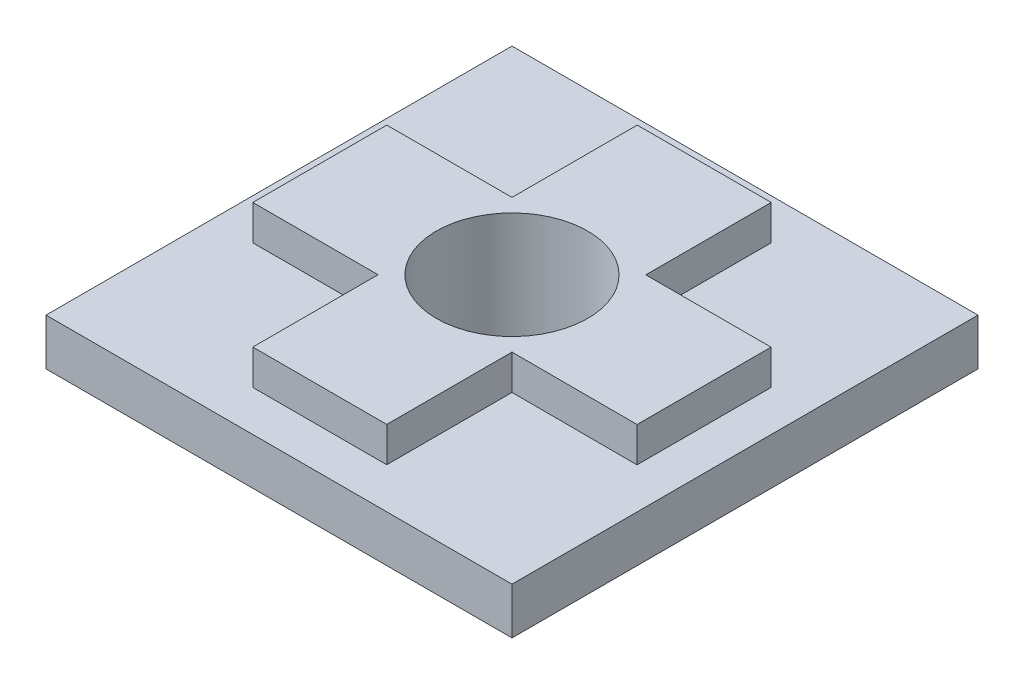
ISO-10303-21;
HEADER;
FILE_DESCRIPTION(('STEP AP214'),'2;1');
FILE_NAME('part.step','',(''),(''),'','','');
FILE_SCHEMA(('AUTOMOTIVE_DESIGN { 1 0 10303 214 1 1 1 1 }'));
ENDSEC;
DATA;
#1=APPLICATION_CONTEXT('core data for automotive mechanical design processes');
#2=APPLICATION_PROTOCOL_DEFINITION('international standard','automotive_design',2000,#1);
#3=PRODUCT_CONTEXT('',#1,'mechanical');
#4=PRODUCT('Part','Part','',(#3));
#5=PRODUCT_RELATED_PRODUCT_CATEGORY('part','',(#4));
#6=PRODUCT_DEFINITION_FORMATION('','',#4);
#7=PRODUCT_DEFINITION_CONTEXT('part definition',#1,'design');
#8=PRODUCT_DEFINITION('design','',#6,#7);
#9=PRODUCT_DEFINITION_SHAPE('','',#8);
#10=(LENGTH_UNIT() NAMED_UNIT(*) SI_UNIT(.MILLI.,.METRE.));
#11=(NAMED_UNIT(*) PLANE_ANGLE_UNIT() SI_UNIT($,.RADIAN.));
#12=(NAMED_UNIT(*) SI_UNIT($,.STERADIAN.) SOLID_ANGLE_UNIT());
#13=UNCERTAINTY_MEASURE_WITH_UNIT(LENGTH_MEASURE(1.E-05),#10,'distance_accuracy_value','');
#14=(GEOMETRIC_REPRESENTATION_CONTEXT(3) GLOBAL_UNCERTAINTY_ASSIGNED_CONTEXT((#13)) GLOBAL_UNIT_ASSIGNED_CONTEXT((#10,
#11,#12)) REPRESENTATION_CONTEXT('',''));
#15=CARTESIAN_POINT('',(0.,0.,0.));
#16=DIRECTION('',(0.,0.,1.));
#17=DIRECTION('',(1.,0.,0.));
#18=AXIS2_PLACEMENT_3D('',#15,#16,#17);
#19=CARTESIAN_POINT('',(0.,3.5,0.));
#20=DIRECTION('',(0.,-1.,0.));
#21=DIRECTION('',(0.,0.,-1.));
#22=AXIS2_PLACEMENT_3D('',#19,#20,#21);
#23=PLANE('',#22);
#24=DIRECTION('',(0.,0.,1.));
#25=VECTOR('',#24,1.);
#26=CARTESIAN_POINT('',(-2.875,3.5,-8.25));
#27=LINE('',#26,#25);
#28=CARTESIAN_POINT('',(-2.875,3.5,-8.25));
#29=VERTEX_POINT('',#28);
#30=CARTESIAN_POINT('',(-2.875,3.5,-2.875));
#31=VERTEX_POINT('',#30);
#32=EDGE_CURVE('E228',#29,#31,#27,.T.);
#33=ORIENTED_EDGE('',*,*,#32,.T.);
#34=DIRECTION('',(-1.,0.,0.));
#35=VECTOR('',#34,1.);
#36=CARTESIAN_POINT('',(-2.875,3.5,-2.875));
#37=LINE('',#36,#35);
#38=CARTESIAN_POINT('',(-8.25,3.5,-2.875));
#39=VERTEX_POINT('',#38);
#40=EDGE_CURVE('E236',#31,#39,#37,.T.);
#41=ORIENTED_EDGE('',*,*,#40,.T.);
#42=DIRECTION('',(0.,0.,1.));
#43=VECTOR('',#42,1.);
#44=CARTESIAN_POINT('',(-8.25,3.5,2.875));
#45=LINE('',#44,#43);
#46=CARTESIAN_POINT('',(-8.25,3.5,2.875));
#47=VERTEX_POINT('',#46);
#48=EDGE_CURVE('E244',#39,#47,#45,.T.);
#49=ORIENTED_EDGE('',*,*,#48,.T.);
#50=DIRECTION('',(1.,0.,0.));
#51=VECTOR('',#50,1.);
#52=CARTESIAN_POINT('',(-8.25,3.5,2.875));
#53=LINE('',#52,#51);
#54=CARTESIAN_POINT('',(-2.875,3.5,2.875));
#55=VERTEX_POINT('',#54);
#56=EDGE_CURVE('E262',#47,#55,#53,.T.);
#57=ORIENTED_EDGE('',*,*,#56,.T.);
#58=DIRECTION('',(0.,0.,1.));
#59=VECTOR('',#58,1.);
#60=CARTESIAN_POINT('',(-2.875,3.5,2.875));
#61=LINE('',#60,#59);
#62=CARTESIAN_POINT('',(-2.875,3.5,8.25));
#63=VERTEX_POINT('',#62);
#64=EDGE_CURVE('E266',#55,#63,#61,.T.);
#65=ORIENTED_EDGE('',*,*,#64,.T.);
#66=DIRECTION('',(1.,0.,0.));
#67=VECTOR('',#66,1.);
#68=CARTESIAN_POINT('',(-2.875,3.5,8.25));
#69=LINE('',#68,#67);
#70=CARTESIAN_POINT('',(2.875,3.5,8.25));
#71=VERTEX_POINT('',#70);
#72=EDGE_CURVE('E270',#63,#71,#69,.T.);
#73=ORIENTED_EDGE('',*,*,#72,.T.);
#74=DIRECTION('',(0.,0.,-1.));
#75=VECTOR('',#74,1.);
#76=CARTESIAN_POINT('',(2.875,3.5,8.25));
#77=LINE('',#76,#75);
#78=CARTESIAN_POINT('',(2.875,3.5,2.875));
#79=VERTEX_POINT('',#78);
#80=EDGE_CURVE('E274',#71,#79,#77,.T.);
#81=ORIENTED_EDGE('',*,*,#80,.T.);
#82=DIRECTION('',(0.999999019991865,0.,0.00140000546784625));
#83=VECTOR('',#82,1.);
#84=CARTESIAN_POINT('',(2.875,3.5,2.875));
#85=LINE('',#84,#83);
#86=CARTESIAN_POINT('',(8.25,3.5,2.88252503676427));
#87=VERTEX_POINT('',#86);
#88=EDGE_CURVE('E278',#79,#87,#85,.T.);
#89=ORIENTED_EDGE('',*,*,#88,.T.);
#90=DIRECTION('',(0.,0.,-1.));
#91=VECTOR('',#90,1.);
#92=CARTESIAN_POINT('',(8.25,3.5,2.88252503676427));
#93=LINE('',#92,#91);
#94=CARTESIAN_POINT('',(8.25,3.5,-2.86747496323573));
#95=VERTEX_POINT('',#94);
#96=EDGE_CURVE('E282',#87,#95,#93,.T.);
#97=ORIENTED_EDGE('',*,*,#96,.T.);
#98=DIRECTION('',(-1.,0.,0.));
#99=VECTOR('',#98,1.);
#100=CARTESIAN_POINT('',(8.25,3.5,-2.86747496323573));
#101=LINE('',#100,#99);
#102=CARTESIAN_POINT('',(2.875,3.5,-2.86747496323573));
#103=VERTEX_POINT('',#102);
#104=EDGE_CURVE('E286',#95,#103,#101,.T.);
#105=ORIENTED_EDGE('',*,*,#104,.T.);
#106=DIRECTION('',(0.,0.,-1.));
#107=VECTOR('',#106,1.);
#108=CARTESIAN_POINT('',(2.875,3.5,-2.86747496323573));
#109=LINE('',#108,#107);
#110=CARTESIAN_POINT('',(2.875,3.5,-8.25));
#111=VERTEX_POINT('',#110);
#112=EDGE_CURVE('E290',#103,#111,#109,.T.);
#113=ORIENTED_EDGE('',*,*,#112,.T.);
#114=DIRECTION('',(-1.,0.,0.));
#115=VECTOR('',#114,1.);
#116=CARTESIAN_POINT('',(-2.875,3.5,-8.25));
#117=LINE('',#116,#115);
#118=EDGE_CURVE('E250',#111,#29,#117,.T.);
#119=ORIENTED_EDGE('',*,*,#118,.T.);
#120=EDGE_LOOP('',(#33,#41,#49,#57,#65,#73,#81,#89,#97,#105,#113,#119));
#121=FACE_BOUND('',#120,.T.);
#122=CARTESIAN_POINT('',(0.,3.5,0.));
#123=DIRECTION('',(0.,1.,0.));
#124=DIRECTION('',(0.,0.,1.));
#125=AXIS2_PLACEMENT_3D('',#122,#123,#124);
#126=CIRCLE('',#125,3.25);
#127=CARTESIAN_POINT('',(0.,3.5,3.25));
#128=VERTEX_POINT('',#127);
#129=EDGE_CURVE('E256',#128,#128,#126,.T.);
#130=ORIENTED_EDGE('',*,*,#129,.F.);
#131=EDGE_LOOP('',(#130));
#132=FACE_BOUND('',#131,.T.);
#133=ADVANCED_FACE('F39',(#121,#132),#23,.F.);
#134=CARTESIAN_POINT('',(10.,2.,-10.));
#135=DIRECTION('',(-1.,0.,0.));
#136=DIRECTION('',(0.,0.,1.));
#137=AXIS2_PLACEMENT_3D('',#134,#135,#136);
#138=PLANE('',#137);
#139=DIRECTION('',(0.,0.,-1.));
#140=VECTOR('',#139,1.);
#141=CARTESIAN_POINT('',(10.,0.,-10.));
#142=LINE('',#141,#140);
#143=CARTESIAN_POINT('',(10.,0.,10.));
#144=VERTEX_POINT('',#143);
#145=CARTESIAN_POINT('',(10.,0.,-10.));
#146=VERTEX_POINT('',#145);
#147=EDGE_CURVE('E439',#144,#146,#142,.T.);
#148=ORIENTED_EDGE('',*,*,#147,.T.);
#149=DIRECTION('',(0.,-1.,0.));
#150=VECTOR('',#149,1.);
#151=CARTESIAN_POINT('',(10.,2.,-10.));
#152=LINE('',#151,#150);
#153=CARTESIAN_POINT('',(10.,2.,-10.));
#154=VERTEX_POINT('',#153);
#155=EDGE_CURVE('E477',#154,#146,#152,.T.);
#156=ORIENTED_EDGE('',*,*,#155,.F.);
#157=DIRECTION('',(0.,0.,-1.));
#158=VECTOR('',#157,1.);
#159=CARTESIAN_POINT('',(10.,2.,-10.));
#160=LINE('',#159,#158);
#161=CARTESIAN_POINT('',(10.,2.,10.));
#162=VERTEX_POINT('',#161);
#163=EDGE_CURVE('E440',#162,#154,#160,.T.);
#164=ORIENTED_EDGE('',*,*,#163,.F.);
#165=DIRECTION('',(0.,-1.,0.));
#166=VECTOR('',#165,1.);
#167=CARTESIAN_POINT('',(10.,2.,10.));
#168=LINE('',#167,#166);
#169=EDGE_CURVE('E454',#162,#144,#168,.T.);
#170=ORIENTED_EDGE('',*,*,#169,.T.);
#171=EDGE_LOOP('',(#148,#156,#164,#170));
#172=FACE_BOUND('',#171,.T.);
#173=ADVANCED_FACE('F41',(#172),#138,.F.);
#174=CARTESIAN_POINT('',(-10.,2.,-10.));
#175=DIRECTION('',(0.,0.,1.));
#176=DIRECTION('',(1.,0.,0.));
#177=AXIS2_PLACEMENT_3D('',#174,#175,#176);
#178=PLANE('',#177);
#179=DIRECTION('',(-1.,0.,0.));
#180=VECTOR('',#179,1.);
#181=CARTESIAN_POINT('',(-10.,0.,-10.));
#182=LINE('',#181,#180);
#183=CARTESIAN_POINT('',(-10.,0.,-10.));
#184=VERTEX_POINT('',#183);
#185=EDGE_CURVE('E458',#146,#184,#182,.T.);
#186=ORIENTED_EDGE('',*,*,#185,.T.);
#187=DIRECTION('',(0.,-1.,0.));
#188=VECTOR('',#187,1.);
#189=CARTESIAN_POINT('',(-10.,2.,-10.));
#190=LINE('',#189,#188);
#191=CARTESIAN_POINT('',(-10.,2.,-10.));
#192=VERTEX_POINT('',#191);
#193=EDGE_CURVE('E473',#192,#184,#190,.T.);
#194=ORIENTED_EDGE('',*,*,#193,.F.);
#195=DIRECTION('',(-1.,0.,0.));
#196=VECTOR('',#195,1.);
#197=CARTESIAN_POINT('',(-10.,2.,-10.));
#198=LINE('',#197,#196);
#199=EDGE_CURVE('E444',#154,#192,#198,.T.);
#200=ORIENTED_EDGE('',*,*,#199,.F.);
#201=ORIENTED_EDGE('',*,*,#155,.T.);
#202=EDGE_LOOP('',(#186,#194,#200,#201));
#203=FACE_BOUND('',#202,.T.);
#204=ADVANCED_FACE('F582',(#203),#178,.F.);
#205=CARTESIAN_POINT('',(-10.,2.,-10.));
#206=DIRECTION('',(1.,0.,0.));
#207=DIRECTION('',(0.,0.,-1.));
#208=AXIS2_PLACEMENT_3D('',#205,#206,#207);
#209=PLANE('',#208);
#210=DIRECTION('',(0.,0.,1.));
#211=VECTOR('',#210,1.);
#212=CARTESIAN_POINT('',(-10.,0.,-10.));
#213=LINE('',#212,#211);
#214=CARTESIAN_POINT('',(-10.,0.,10.));
#215=VERTEX_POINT('',#214);
#216=EDGE_CURVE('E461',#184,#215,#213,.T.);
#217=ORIENTED_EDGE('',*,*,#216,.T.);
#218=DIRECTION('',(0.,-1.,0.));
#219=VECTOR('',#218,1.);
#220=CARTESIAN_POINT('',(-10.,2.,10.));
#221=LINE('',#220,#219);
#222=CARTESIAN_POINT('',(-10.,2.,10.));
#223=VERTEX_POINT('',#222);
#224=EDGE_CURVE('E469',#223,#215,#221,.T.);
#225=ORIENTED_EDGE('',*,*,#224,.F.);
#226=DIRECTION('',(0.,0.,1.));
#227=VECTOR('',#226,1.);
#228=CARTESIAN_POINT('',(-10.,2.,-10.));
#229=LINE('',#228,#227);
#230=EDGE_CURVE('E448',#192,#223,#229,.T.);
#231=ORIENTED_EDGE('',*,*,#230,.F.);
#232=ORIENTED_EDGE('',*,*,#193,.T.);
#233=EDGE_LOOP('',(#217,#225,#231,#232));
#234=FACE_BOUND('',#233,.T.);
#235=ADVANCED_FACE('F653',(#234),#209,.F.);
#236=CARTESIAN_POINT('',(-10.,2.,10.));
#237=DIRECTION('',(0.,0.,-1.));
#238=DIRECTION('',(-1.,0.,0.));
#239=AXIS2_PLACEMENT_3D('',#236,#237,#238);
#240=PLANE('',#239);
#241=DIRECTION('',(1.,0.,0.));
#242=VECTOR('',#241,1.);
#243=CARTESIAN_POINT('',(-10.,0.,10.));
#244=LINE('',#243,#242);
#245=EDGE_CURVE('E445',#215,#144,#244,.T.);
#246=ORIENTED_EDGE('',*,*,#245,.T.);
#247=ORIENTED_EDGE('',*,*,#169,.F.);
#248=DIRECTION('',(1.,0.,0.));
#249=VECTOR('',#248,1.);
#250=CARTESIAN_POINT('',(-10.,2.,10.));
#251=LINE('',#250,#249);
#252=EDGE_CURVE('E451',#223,#162,#251,.T.);
#253=ORIENTED_EDGE('',*,*,#252,.F.);
#254=ORIENTED_EDGE('',*,*,#224,.T.);
#255=EDGE_LOOP('',(#246,#247,#253,#254));
#256=FACE_BOUND('',#255,.T.);
#257=ADVANCED_FACE('F640',(#256),#240,.F.);
#258=CARTESIAN_POINT('',(0.,2.,0.));
#259=DIRECTION('',(0.,1.,0.));
#260=DIRECTION('',(0.,0.,1.));
#261=AXIS2_PLACEMENT_3D('',#258,#259,#260);
#262=PLANE('',#261);
#263=DIRECTION('',(0.,0.,1.));
#264=VECTOR('',#263,1.);
#265=CARTESIAN_POINT('',(-2.875,2.,0.));
#266=LINE('',#265,#264);
#267=CARTESIAN_POINT('',(-2.875,2.,-8.25));
#268=VERTEX_POINT('',#267);
#269=CARTESIAN_POINT('',(-2.875,2.,-2.875));
#270=VERTEX_POINT('',#269);
#271=EDGE_CURVE('E55',#268,#270,#266,.T.);
#272=ORIENTED_EDGE('',*,*,#271,.F.);
#273=DIRECTION('',(-1.,0.,0.));
#274=VECTOR('',#273,1.);
#275=CARTESIAN_POINT('',(0.,2.,-8.25));
#276=LINE('',#275,#274);
#277=CARTESIAN_POINT('',(2.875,2.,-8.25));
#278=VERTEX_POINT('',#277);
#279=EDGE_CURVE('E59',#278,#268,#276,.T.);
#280=ORIENTED_EDGE('',*,*,#279,.F.);
#281=DIRECTION('',(0.,0.,-1.));
#282=VECTOR('',#281,1.);
#283=CARTESIAN_POINT('',(2.875,2.,0.));
#284=LINE('',#283,#282);
#285=CARTESIAN_POINT('',(2.875,2.,-2.86747496323573));
#286=VERTEX_POINT('',#285);
#287=EDGE_CURVE('E432',#286,#278,#284,.T.);
#288=ORIENTED_EDGE('',*,*,#287,.F.);
#289=DIRECTION('',(-1.,0.,0.));
#290=VECTOR('',#289,1.);
#291=CARTESIAN_POINT('',(0.,2.,-2.86747496323573));
#292=LINE('',#291,#290);
#293=CARTESIAN_POINT('',(8.25,2.,-2.86747496323573));
#294=VERTEX_POINT('',#293);
#295=EDGE_CURVE('E428',#294,#286,#292,.T.);
#296=ORIENTED_EDGE('',*,*,#295,.F.);
#297=DIRECTION('',(0.,0.,-1.));
#298=VECTOR('',#297,1.);
#299=CARTESIAN_POINT('',(8.25,2.,0.));
#300=LINE('',#299,#298);
#301=CARTESIAN_POINT('',(8.25,2.,2.88252503676427));
#302=VERTEX_POINT('',#301);
#303=EDGE_CURVE('E424',#302,#294,#300,.T.);
#304=ORIENTED_EDGE('',*,*,#303,.F.);
#305=DIRECTION('',(0.999999019991865,0.,0.00140000546784625));
#306=VECTOR('',#305,1.);
#307=CARTESIAN_POINT('',(-0.00401937673149358,2.,2.87096935318047));
#308=LINE('',#307,#306);
#309=CARTESIAN_POINT('',(2.875,2.,2.875));
#310=VERTEX_POINT('',#309);
#311=EDGE_CURVE('E420',#310,#302,#308,.T.);
#312=ORIENTED_EDGE('',*,*,#311,.F.);
#313=DIRECTION('',(0.,0.,-1.));
#314=VECTOR('',#313,1.);
#315=CARTESIAN_POINT('',(2.875,2.,0.));
#316=LINE('',#315,#314);
#317=CARTESIAN_POINT('',(2.875,2.,8.25));
#318=VERTEX_POINT('',#317);
#319=EDGE_CURVE('E416',#318,#310,#316,.T.);
#320=ORIENTED_EDGE('',*,*,#319,.F.);
#321=DIRECTION('',(1.,0.,0.));
#322=VECTOR('',#321,1.);
#323=CARTESIAN_POINT('',(0.,2.,8.25));
#324=LINE('',#323,#322);
#325=CARTESIAN_POINT('',(-2.875,2.,8.25));
#326=VERTEX_POINT('',#325);
#327=EDGE_CURVE('E412',#326,#318,#324,.T.);
#328=ORIENTED_EDGE('',*,*,#327,.F.);
#329=DIRECTION('',(0.,0.,1.));
#330=VECTOR('',#329,1.);
#331=CARTESIAN_POINT('',(-2.875,2.,0.));
#332=LINE('',#331,#330);
#333=CARTESIAN_POINT('',(-2.875,2.,2.875));
#334=VERTEX_POINT('',#333);
#335=EDGE_CURVE('E408',#334,#326,#332,.T.);
#336=ORIENTED_EDGE('',*,*,#335,.F.);
#337=DIRECTION('',(1.,0.,0.));
#338=VECTOR('',#337,1.);
#339=CARTESIAN_POINT('',(0.,2.,2.875));
#340=LINE('',#339,#338);
#341=CARTESIAN_POINT('',(-8.25,2.,2.875));
#342=VERTEX_POINT('',#341);
#343=EDGE_CURVE('E404',#342,#334,#340,.T.);
#344=ORIENTED_EDGE('',*,*,#343,.F.);
#345=DIRECTION('',(0.,0.,1.));
#346=VECTOR('',#345,1.);
#347=CARTESIAN_POINT('',(-8.25,2.,0.));
#348=LINE('',#347,#346);
#349=CARTESIAN_POINT('',(-8.25,2.,-2.875));
#350=VERTEX_POINT('',#349);
#351=EDGE_CURVE('E400',#350,#342,#348,.T.);
#352=ORIENTED_EDGE('',*,*,#351,.F.);
#353=DIRECTION('',(-1.,0.,0.));
#354=VECTOR('',#353,1.);
#355=CARTESIAN_POINT('',(0.,2.,-2.875));
#356=LINE('',#355,#354);
#357=EDGE_CURVE('E346',#270,#350,#356,.T.);
#358=ORIENTED_EDGE('',*,*,#357,.F.);
#359=EDGE_LOOP('',(#272,#280,#288,#296,#304,#312,#320,#328,#336,#344,#352,#358));
#360=FACE_BOUND('',#359,.T.);
#361=ORIENTED_EDGE('',*,*,#163,.T.);
#362=ORIENTED_EDGE('',*,*,#199,.T.);
#363=ORIENTED_EDGE('',*,*,#230,.T.);
#364=ORIENTED_EDGE('',*,*,#252,.T.);
#365=EDGE_LOOP('',(#361,#362,#363,#364));
#366=FACE_BOUND('',#365,.T.);
#367=ADVANCED_FACE('F637',(#360,#366),#262,.T.);
#368=CARTESIAN_POINT('',(0.,0.,0.));
#369=DIRECTION('',(0.,1.,0.));
#370=DIRECTION('',(0.,0.,1.));
#371=AXIS2_PLACEMENT_3D('',#368,#369,#370);
#372=PLANE('',#371);
#373=DIRECTION('',(-1.,0.,0.));
#374=VECTOR('',#373,1.);
#375=CARTESIAN_POINT('',(0.,0.,-8.25));
#376=LINE('',#375,#374);
#377=CARTESIAN_POINT('',(2.875,0.,-8.25));
#378=VERTEX_POINT('',#377);
#379=CARTESIAN_POINT('',(-2.875,0.,-8.25));
#380=VERTEX_POINT('',#379);
#381=EDGE_CURVE('E48',#378,#380,#376,.T.);
#382=ORIENTED_EDGE('',*,*,#381,.T.);
#383=DIRECTION('',(0.,0.,1.));
#384=VECTOR('',#383,1.);
#385=CARTESIAN_POINT('',(-2.875,0.,0.));
#386=LINE('',#385,#384);
#387=CARTESIAN_POINT('',(-2.875,0.,-2.875));
#388=VERTEX_POINT('',#387);
#389=EDGE_CURVE('E11',#380,#388,#386,.T.);
#390=ORIENTED_EDGE('',*,*,#389,.T.);
#391=DIRECTION('',(-1.,0.,0.));
#392=VECTOR('',#391,1.);
#393=CARTESIAN_POINT('',(0.,0.,-2.875));
#394=LINE('',#393,#392);
#395=CARTESIAN_POINT('',(-8.25,0.,-2.875));
#396=VERTEX_POINT('',#395);
#397=EDGE_CURVE('E481',#388,#396,#394,.T.);
#398=ORIENTED_EDGE('',*,*,#397,.T.);
#399=DIRECTION('',(0.,0.,1.));
#400=VECTOR('',#399,1.);
#401=CARTESIAN_POINT('',(-8.25,0.,0.));
#402=LINE('',#401,#400);
#403=CARTESIAN_POINT('',(-8.25,0.,2.875));
#404=VERTEX_POINT('',#403);
#405=EDGE_CURVE('E485',#396,#404,#402,.T.);
#406=ORIENTED_EDGE('',*,*,#405,.T.);
#407=DIRECTION('',(1.,0.,0.));
#408=VECTOR('',#407,1.);
#409=CARTESIAN_POINT('',(0.,0.,2.875));
#410=LINE('',#409,#408);
#411=CARTESIAN_POINT('',(-2.875,0.,2.875));
#412=VERTEX_POINT('',#411);
#413=EDGE_CURVE('E489',#404,#412,#410,.T.);
#414=ORIENTED_EDGE('',*,*,#413,.T.);
#415=DIRECTION('',(0.,0.,1.));
#416=VECTOR('',#415,1.);
#417=CARTESIAN_POINT('',(-2.875,0.,0.));
#418=LINE('',#417,#416);
#419=CARTESIAN_POINT('',(-2.875,0.,8.25));
#420=VERTEX_POINT('',#419);
#421=EDGE_CURVE('E493',#412,#420,#418,.T.);
#422=ORIENTED_EDGE('',*,*,#421,.T.);
#423=DIRECTION('',(1.,0.,0.));
#424=VECTOR('',#423,1.);
#425=CARTESIAN_POINT('',(0.,0.,8.25));
#426=LINE('',#425,#424);
#427=CARTESIAN_POINT('',(2.875,0.,8.25));
#428=VERTEX_POINT('',#427);
#429=EDGE_CURVE('E497',#420,#428,#426,.T.);
#430=ORIENTED_EDGE('',*,*,#429,.T.);
#431=DIRECTION('',(0.,0.,-1.));
#432=VECTOR('',#431,1.);
#433=CARTESIAN_POINT('',(2.875,0.,0.));
#434=LINE('',#433,#432);
#435=CARTESIAN_POINT('',(2.875,0.,2.875));
#436=VERTEX_POINT('',#435);
#437=EDGE_CURVE('E501',#428,#436,#434,.T.);
#438=ORIENTED_EDGE('',*,*,#437,.T.);
#439=DIRECTION('',(0.999999019991865,0.,0.00140000546784625));
#440=VECTOR('',#439,1.);
#441=CARTESIAN_POINT('',(-0.00401937673149358,0.,2.87096935318047));
#442=LINE('',#441,#440);
#443=CARTESIAN_POINT('',(8.25,0.,2.88252503676427));
#444=VERTEX_POINT('',#443);
#445=EDGE_CURVE('E505',#436,#444,#442,.T.);
#446=ORIENTED_EDGE('',*,*,#445,.T.);
#447=DIRECTION('',(0.,0.,-1.));
#448=VECTOR('',#447,1.);
#449=CARTESIAN_POINT('',(8.25,0.,0.));
#450=LINE('',#449,#448);
#451=CARTESIAN_POINT('',(8.25,0.,-2.86747496323573));
#452=VERTEX_POINT('',#451);
#453=EDGE_CURVE('E509',#444,#452,#450,.T.);
#454=ORIENTED_EDGE('',*,*,#453,.T.);
#455=DIRECTION('',(-1.,0.,0.));
#456=VECTOR('',#455,1.);
#457=CARTESIAN_POINT('',(0.,0.,-2.86747496323573));
#458=LINE('',#457,#456);
#459=CARTESIAN_POINT('',(2.875,0.,-2.86747496323573));
#460=VERTEX_POINT('',#459);
#461=EDGE_CURVE('E513',#452,#460,#458,.T.);
#462=ORIENTED_EDGE('',*,*,#461,.T.);
#463=DIRECTION('',(0.,0.,-1.));
#464=VECTOR('',#463,1.);
#465=CARTESIAN_POINT('',(2.875,0.,0.));
#466=LINE('',#465,#464);
#467=EDGE_CURVE('E517',#460,#378,#466,.T.);
#468=ORIENTED_EDGE('',*,*,#467,.T.);
#469=EDGE_LOOP('',(#382,#390,#398,#406,#414,#422,#430,#438,#446,#454,#462,#468));
#470=FACE_BOUND('',#469,.T.);
#471=ORIENTED_EDGE('',*,*,#147,.F.);
#472=ORIENTED_EDGE('',*,*,#245,.F.);
#473=ORIENTED_EDGE('',*,*,#216,.F.);
#474=ORIENTED_EDGE('',*,*,#185,.F.);
#475=EDGE_LOOP('',(#471,#472,#473,#474));
#476=FACE_BOUND('',#475,.T.);
#477=ADVANCED_FACE('F523',(#470,#476),#372,.F.);
#478=CARTESIAN_POINT('',(0.,-1.5,0.));
#479=DIRECTION('',(0.,-1.,0.));
#480=DIRECTION('',(0.,0.,-1.));
#481=AXIS2_PLACEMENT_3D('',#478,#479,#480);
#482=PLANE('',#481);
#483=CARTESIAN_POINT('',(0.,-1.5,0.));
#484=DIRECTION('',(0.,1.,0.));
#485=DIRECTION('',(0.,0.,1.));
#486=AXIS2_PLACEMENT_3D('',#483,#484,#485);
#487=CIRCLE('',#486,3.25);
#488=CARTESIAN_POINT('',(0.,-1.5,3.25));
#489=VERTEX_POINT('',#488);
#490=EDGE_CURVE('E252',#489,#489,#487,.T.);
#491=ORIENTED_EDGE('',*,*,#490,.T.);
#492=EDGE_LOOP('',(#491));
#493=FACE_BOUND('',#492,.T.);
#494=DIRECTION('',(0.,0.,1.));
#495=VECTOR('',#494,1.);
#496=CARTESIAN_POINT('',(-2.875,-1.5,-8.25));
#497=LINE('',#496,#495);
#498=CARTESIAN_POINT('',(-2.875,-1.5,-8.25));
#499=VERTEX_POINT('',#498);
#500=CARTESIAN_POINT('',(-2.875,-1.5,-2.875));
#501=VERTEX_POINT('',#500);
#502=EDGE_CURVE('E295',#499,#501,#497,.T.);
#503=ORIENTED_EDGE('',*,*,#502,.F.);
#504=DIRECTION('',(-1.,0.,0.));
#505=VECTOR('',#504,1.);
#506=CARTESIAN_POINT('',(-2.875,-1.5,-8.25));
#507=LINE('',#506,#505);
#508=CARTESIAN_POINT('',(2.875,-1.5,-8.25));
#509=VERTEX_POINT('',#508);
#510=EDGE_CURVE('E233',#509,#499,#507,.T.);
#511=ORIENTED_EDGE('',*,*,#510,.F.);
#512=DIRECTION('',(0.,0.,-1.));
#513=VECTOR('',#512,1.);
#514=CARTESIAN_POINT('',(2.875,-1.5,-2.86747496323573));
#515=LINE('',#514,#513);
#516=CARTESIAN_POINT('',(2.875,-1.5,-2.86747496323573));
#517=VERTEX_POINT('',#516);
#518=EDGE_CURVE('E335',#517,#509,#515,.T.);
#519=ORIENTED_EDGE('',*,*,#518,.F.);
#520=DIRECTION('',(-1.,0.,0.));
#521=VECTOR('',#520,1.);
#522=CARTESIAN_POINT('',(8.25,-1.5,-2.86747496323573));
#523=LINE('',#522,#521);
#524=CARTESIAN_POINT('',(8.25,-1.5,-2.86747496323573));
#525=VERTEX_POINT('',#524);
#526=EDGE_CURVE('E331',#525,#517,#523,.T.);
#527=ORIENTED_EDGE('',*,*,#526,.F.);
#528=DIRECTION('',(0.,0.,-1.));
#529=VECTOR('',#528,1.);
#530=CARTESIAN_POINT('',(8.25,-1.5,2.88252503676427));
#531=LINE('',#530,#529);
#532=CARTESIAN_POINT('',(8.25,-1.5,2.88252503676427));
#533=VERTEX_POINT('',#532);
#534=EDGE_CURVE('E327',#533,#525,#531,.T.);
#535=ORIENTED_EDGE('',*,*,#534,.F.);
#536=DIRECTION('',(0.999999019991865,0.,0.00140000546784625));
#537=VECTOR('',#536,1.);
#538=CARTESIAN_POINT('',(2.875,-1.5,2.875));
#539=LINE('',#538,#537);
#540=CARTESIAN_POINT('',(2.875,-1.5,2.875));
#541=VERTEX_POINT('',#540);
#542=EDGE_CURVE('E323',#541,#533,#539,.T.);
#543=ORIENTED_EDGE('',*,*,#542,.F.);
#544=DIRECTION('',(0.,0.,-1.));
#545=VECTOR('',#544,1.);
#546=CARTESIAN_POINT('',(2.875,-1.5,8.25));
#547=LINE('',#546,#545);
#548=CARTESIAN_POINT('',(2.875,-1.5,8.25));
#549=VERTEX_POINT('',#548);
#550=EDGE_CURVE('E319',#549,#541,#547,.T.);
#551=ORIENTED_EDGE('',*,*,#550,.F.);
#552=DIRECTION('',(1.,0.,0.));
#553=VECTOR('',#552,1.);
#554=CARTESIAN_POINT('',(-2.875,-1.5,8.25));
#555=LINE('',#554,#553);
#556=CARTESIAN_POINT('',(-2.875,-1.5,8.25));
#557=VERTEX_POINT('',#556);
#558=EDGE_CURVE('E315',#557,#549,#555,.T.);
#559=ORIENTED_EDGE('',*,*,#558,.F.);
#560=DIRECTION('',(0.,0.,1.));
#561=VECTOR('',#560,1.);
#562=CARTESIAN_POINT('',(-2.875,-1.5,2.875));
#563=LINE('',#562,#561);
#564=CARTESIAN_POINT('',(-2.875,-1.5,2.875));
#565=VERTEX_POINT('',#564);
#566=EDGE_CURVE('E311',#565,#557,#563,.T.);
#567=ORIENTED_EDGE('',*,*,#566,.F.);
#568=DIRECTION('',(1.,0.,0.));
#569=VECTOR('',#568,1.);
#570=CARTESIAN_POINT('',(-8.25,-1.5,2.875));
#571=LINE('',#570,#569);
#572=CARTESIAN_POINT('',(-8.25,-1.5,2.875));
#573=VERTEX_POINT('',#572);
#574=EDGE_CURVE('E307',#573,#565,#571,.T.);
#575=ORIENTED_EDGE('',*,*,#574,.F.);
#576=DIRECTION('',(0.,0.,1.));
#577=VECTOR('',#576,1.);
#578=CARTESIAN_POINT('',(-8.25,-1.5,2.875));
#579=LINE('',#578,#577);
#580=CARTESIAN_POINT('',(-8.25,-1.5,-2.875));
#581=VERTEX_POINT('',#580);
#582=EDGE_CURVE('E303',#581,#573,#579,.T.);
#583=ORIENTED_EDGE('',*,*,#582,.F.);
#584=DIRECTION('',(-1.,0.,0.));
#585=VECTOR('',#584,1.);
#586=CARTESIAN_POINT('',(-2.875,-1.5,-2.875));
#587=LINE('',#586,#585);
#588=EDGE_CURVE('E299',#501,#581,#587,.T.);
#589=ORIENTED_EDGE('',*,*,#588,.F.);
#590=EDGE_LOOP('',(#503,#511,#519,#527,#535,#543,#551,#559,#567,#575,#583,#589));
#591=FACE_BOUND('',#590,.T.);
#592=ADVANCED_FACE('F534',(#493,#591),#482,.T.);
#593=CARTESIAN_POINT('',(-2.875,-1.5,-2.875));
#594=DIRECTION('',(0.,0.,-1.));
#595=DIRECTION('',(-1.,0.,0.));
#596=AXIS2_PLACEMENT_3D('',#593,#594,#595);
#597=PLANE('',#596);
#598=ORIENTED_EDGE('',*,*,#397,.F.);
#599=DIRECTION('',(0.,1.,0.));
#600=VECTOR('',#599,1.);
#601=CARTESIAN_POINT('',(-2.875,-1.5,-2.875));
#602=LINE('',#601,#600);
#603=EDGE_CURVE('E232',#501,#388,#602,.T.);
#604=ORIENTED_EDGE('',*,*,#603,.F.);
#605=ORIENTED_EDGE('',*,*,#588,.T.);
#606=DIRECTION('',(0.,1.,0.));
#607=VECTOR('',#606,1.);
#608=CARTESIAN_POINT('',(-8.25,-1.5,-2.875));
#609=LINE('',#608,#607);
#610=EDGE_CURVE('E393',#581,#396,#609,.T.);
#611=ORIENTED_EDGE('',*,*,#610,.T.);
#612=EDGE_LOOP('',(#598,#604,#605,#611));
#613=FACE_BOUND('',#612,.T.);
#614=ADVANCED_FACE('F540',(#613),#597,.T.);
#615=CARTESIAN_POINT('',(-8.25,-1.5,2.875));
#616=DIRECTION('',(-1.,0.,0.));
#617=DIRECTION('',(0.,0.,1.));
#618=AXIS2_PLACEMENT_3D('',#615,#616,#617);
#619=PLANE('',#618);
#620=ORIENTED_EDGE('',*,*,#405,.F.);
#621=ORIENTED_EDGE('',*,*,#610,.F.);
#622=ORIENTED_EDGE('',*,*,#582,.T.);
#623=DIRECTION('',(0.,1.,0.));
#624=VECTOR('',#623,1.);
#625=CARTESIAN_POINT('',(-8.25,-1.5,2.875));
#626=LINE('',#625,#624);
#627=EDGE_CURVE('E388',#573,#404,#626,.T.);
#628=ORIENTED_EDGE('',*,*,#627,.T.);
#629=EDGE_LOOP('',(#620,#621,#622,#628));
#630=FACE_BOUND('',#629,.T.);
#631=ADVANCED_FACE('F543',(#630),#619,.T.);
#632=CARTESIAN_POINT('',(-8.25,-1.5,2.875));
#633=DIRECTION('',(0.,0.,1.));
#634=DIRECTION('',(1.,0.,0.));
#635=AXIS2_PLACEMENT_3D('',#632,#633,#634);
#636=PLANE('',#635);
#637=ORIENTED_EDGE('',*,*,#413,.F.);
#638=ORIENTED_EDGE('',*,*,#627,.F.);
#639=ORIENTED_EDGE('',*,*,#574,.T.);
#640=DIRECTION('',(0.,1.,0.));
#641=VECTOR('',#640,1.);
#642=CARTESIAN_POINT('',(-2.875,-1.5,2.875));
#643=LINE('',#642,#641);
#644=EDGE_CURVE('E383',#565,#412,#643,.T.);
#645=ORIENTED_EDGE('',*,*,#644,.T.);
#646=EDGE_LOOP('',(#637,#638,#639,#645));
#647=FACE_BOUND('',#646,.T.);
#648=ADVANCED_FACE('F546',(#647),#636,.T.);
#649=CARTESIAN_POINT('',(-2.875,-1.5,2.875));
#650=DIRECTION('',(-1.,0.,0.));
#651=DIRECTION('',(0.,0.,1.));
#652=AXIS2_PLACEMENT_3D('',#649,#650,#651);
#653=PLANE('',#652);
#654=ORIENTED_EDGE('',*,*,#421,.F.);
#655=ORIENTED_EDGE('',*,*,#644,.F.);
#656=ORIENTED_EDGE('',*,*,#566,.T.);
#657=DIRECTION('',(0.,1.,0.));
#658=VECTOR('',#657,1.);
#659=CARTESIAN_POINT('',(-2.875,-1.5,8.25));
#660=LINE('',#659,#658);
#661=EDGE_CURVE('E378',#557,#420,#660,.T.);
#662=ORIENTED_EDGE('',*,*,#661,.T.);
#663=EDGE_LOOP('',(#654,#655,#656,#662));
#664=FACE_BOUND('',#663,.T.);
#665=ADVANCED_FACE('F551',(#664),#653,.T.);
#666=CARTESIAN_POINT('',(-2.875,-1.5,8.25));
#667=DIRECTION('',(0.,0.,1.));
#668=DIRECTION('',(1.,0.,0.));
#669=AXIS2_PLACEMENT_3D('',#666,#667,#668);
#670=PLANE('',#669);
#671=ORIENTED_EDGE('',*,*,#429,.F.);
#672=ORIENTED_EDGE('',*,*,#661,.F.);
#673=ORIENTED_EDGE('',*,*,#558,.T.);
#674=DIRECTION('',(0.,1.,0.));
#675=VECTOR('',#674,1.);
#676=CARTESIAN_POINT('',(2.875,-1.5,8.25));
#677=LINE('',#676,#675);
#678=EDGE_CURVE('E373',#549,#428,#677,.T.);
#679=ORIENTED_EDGE('',*,*,#678,.T.);
#680=EDGE_LOOP('',(#671,#672,#673,#679));
#681=FACE_BOUND('',#680,.T.);
#682=ADVANCED_FACE('F553',(#681),#670,.T.);
#683=CARTESIAN_POINT('',(2.875,-1.5,8.25));
#684=DIRECTION('',(1.,0.,0.));
#685=DIRECTION('',(0.,0.,-1.));
#686=AXIS2_PLACEMENT_3D('',#683,#684,#685);
#687=PLANE('',#686);
#688=ORIENTED_EDGE('',*,*,#437,.F.);
#689=ORIENTED_EDGE('',*,*,#678,.F.);
#690=ORIENTED_EDGE('',*,*,#550,.T.);
#691=DIRECTION('',(0.,1.,0.));
#692=VECTOR('',#691,1.);
#693=CARTESIAN_POINT('',(2.875,-1.5,2.875));
#694=LINE('',#693,#692);
#695=EDGE_CURVE('E368',#541,#436,#694,.T.);
#696=ORIENTED_EDGE('',*,*,#695,.T.);
#697=EDGE_LOOP('',(#688,#689,#690,#696));
#698=FACE_BOUND('',#697,.T.);
#699=ADVANCED_FACE('F555',(#698),#687,.T.);
#700=CARTESIAN_POINT('',(2.875,-1.5,2.875));
#701=DIRECTION('',(-0.00140000546784625,0.,0.999999019991865));
#702=DIRECTION('',(0.999999019991865,0.,0.00140000546784625));
#703=AXIS2_PLACEMENT_3D('',#700,#701,#702);
#704=PLANE('',#703);
#705=ORIENTED_EDGE('',*,*,#445,.F.);
#706=ORIENTED_EDGE('',*,*,#695,.F.);
#707=ORIENTED_EDGE('',*,*,#542,.T.);
#708=DIRECTION('',(0.,1.,0.));
#709=VECTOR('',#708,1.);
#710=CARTESIAN_POINT('',(8.25,-1.5,2.88252503676427));
#711=LINE('',#710,#709);
#712=EDGE_CURVE('E363',#533,#444,#711,.T.);
#713=ORIENTED_EDGE('',*,*,#712,.T.);
#714=EDGE_LOOP('',(#705,#706,#707,#713));
#715=FACE_BOUND('',#714,.T.);
#716=ADVANCED_FACE('F559',(#715),#704,.T.);
#717=CARTESIAN_POINT('',(8.25,-1.5,2.88252503676427));
#718=DIRECTION('',(1.,0.,0.));
#719=DIRECTION('',(0.,0.,-1.));
#720=AXIS2_PLACEMENT_3D('',#717,#718,#719);
#721=PLANE('',#720);
#722=ORIENTED_EDGE('',*,*,#453,.F.);
#723=ORIENTED_EDGE('',*,*,#712,.F.);
#724=ORIENTED_EDGE('',*,*,#534,.T.);
#725=DIRECTION('',(0.,1.,0.));
#726=VECTOR('',#725,1.);
#727=CARTESIAN_POINT('',(8.25,-1.5,-2.86747496323573));
#728=LINE('',#727,#726);
#729=EDGE_CURVE('E358',#525,#452,#728,.T.);
#730=ORIENTED_EDGE('',*,*,#729,.T.);
#731=EDGE_LOOP('',(#722,#723,#724,#730));
#732=FACE_BOUND('',#731,.T.);
#733=ADVANCED_FACE('F561',(#732),#721,.T.);
#734=CARTESIAN_POINT('',(8.25,-1.5,-2.86747496323573));
#735=DIRECTION('',(0.,0.,-1.));
#736=DIRECTION('',(-1.,0.,0.));
#737=AXIS2_PLACEMENT_3D('',#734,#735,#736);
#738=PLANE('',#737);
#739=ORIENTED_EDGE('',*,*,#461,.F.);
#740=ORIENTED_EDGE('',*,*,#729,.F.);
#741=ORIENTED_EDGE('',*,*,#526,.T.);
#742=DIRECTION('',(0.,1.,0.));
#743=VECTOR('',#742,1.);
#744=CARTESIAN_POINT('',(2.875,-1.5,-2.86747496323573));
#745=LINE('',#744,#743);
#746=EDGE_CURVE('E353',#517,#460,#745,.T.);
#747=ORIENTED_EDGE('',*,*,#746,.T.);
#748=EDGE_LOOP('',(#739,#740,#741,#747));
#749=FACE_BOUND('',#748,.T.);
#750=ADVANCED_FACE('F563',(#749),#738,.T.);
#751=CARTESIAN_POINT('',(2.875,-1.5,-2.86747496323573));
#752=DIRECTION('',(1.,0.,0.));
#753=DIRECTION('',(0.,0.,-1.));
#754=AXIS2_PLACEMENT_3D('',#751,#752,#753);
#755=PLANE('',#754);
#756=ORIENTED_EDGE('',*,*,#467,.F.);
#757=ORIENTED_EDGE('',*,*,#746,.F.);
#758=ORIENTED_EDGE('',*,*,#518,.T.);
#759=DIRECTION('',(0.,1.,0.));
#760=VECTOR('',#759,1.);
#761=CARTESIAN_POINT('',(2.875,-1.5,-8.25));
#762=LINE('',#761,#760);
#763=EDGE_CURVE('E348',#509,#378,#762,.T.);
#764=ORIENTED_EDGE('',*,*,#763,.T.);
#765=EDGE_LOOP('',(#756,#757,#758,#764));
#766=FACE_BOUND('',#765,.T.);
#767=ADVANCED_FACE('F528',(#766),#755,.T.);
#768=CARTESIAN_POINT('',(-2.875,-1.5,-8.25));
#769=DIRECTION('',(0.,0.,-1.));
#770=DIRECTION('',(-1.,0.,0.));
#771=AXIS2_PLACEMENT_3D('',#768,#769,#770);
#772=PLANE('',#771);
#773=ORIENTED_EDGE('',*,*,#381,.F.);
#774=ORIENTED_EDGE('',*,*,#763,.F.);
#775=ORIENTED_EDGE('',*,*,#510,.T.);
#776=DIRECTION('',(0.,1.,0.));
#777=VECTOR('',#776,1.);
#778=CARTESIAN_POINT('',(-2.875,-1.5,-8.25));
#779=LINE('',#778,#777);
#780=EDGE_CURVE('E342',#499,#380,#779,.T.);
#781=ORIENTED_EDGE('',*,*,#780,.T.);
#782=EDGE_LOOP('',(#773,#774,#775,#781));
#783=FACE_BOUND('',#782,.T.);
#784=ADVANCED_FACE('F526',(#783),#772,.T.);
#785=CARTESIAN_POINT('',(-2.875,-1.5,-8.25));
#786=DIRECTION('',(-1.,0.,0.));
#787=DIRECTION('',(0.,0.,1.));
#788=AXIS2_PLACEMENT_3D('',#785,#786,#787);
#789=PLANE('',#788);
#790=ORIENTED_EDGE('',*,*,#389,.F.);
#791=ORIENTED_EDGE('',*,*,#780,.F.);
#792=ORIENTED_EDGE('',*,*,#502,.T.);
#793=ORIENTED_EDGE('',*,*,#603,.T.);
#794=EDGE_LOOP('',(#790,#791,#792,#793));
#795=FACE_BOUND('',#794,.T.);
#796=ADVANCED_FACE('F538',(#795),#789,.T.);
#797=EDGE_CURVE('E347',#268,#29,#779,.T.);
#798=ORIENTED_EDGE('',*,*,#797,.F.);
#799=ORIENTED_EDGE('',*,*,#271,.T.);
#800=EDGE_CURVE('E223',#270,#31,#602,.T.);
#801=ORIENTED_EDGE('',*,*,#800,.T.);
#802=ORIENTED_EDGE('',*,*,#32,.F.);
#803=EDGE_LOOP('',(#798,#799,#801,#802));
#804=FACE_BOUND('',#803,.T.);
#805=ADVANCED_FACE('F226',(#804),#789,.T.);
#806=EDGE_CURVE('E352',#278,#111,#762,.T.);
#807=ORIENTED_EDGE('',*,*,#806,.F.);
#808=ORIENTED_EDGE('',*,*,#279,.T.);
#809=ORIENTED_EDGE('',*,*,#797,.T.);
#810=ORIENTED_EDGE('',*,*,#118,.F.);
#811=EDGE_LOOP('',(#807,#808,#809,#810));
#812=FACE_BOUND('',#811,.T.);
#813=ADVANCED_FACE('F590',(#812),#772,.T.);
#814=EDGE_CURVE('E357',#286,#103,#745,.T.);
#815=ORIENTED_EDGE('',*,*,#814,.F.);
#816=ORIENTED_EDGE('',*,*,#287,.T.);
#817=ORIENTED_EDGE('',*,*,#806,.T.);
#818=ORIENTED_EDGE('',*,*,#112,.F.);
#819=EDGE_LOOP('',(#815,#816,#817,#818));
#820=FACE_BOUND('',#819,.T.);
#821=ADVANCED_FACE('F572',(#820),#755,.T.);
#822=EDGE_CURVE('E362',#294,#95,#728,.T.);
#823=ORIENTED_EDGE('',*,*,#822,.F.);
#824=ORIENTED_EDGE('',*,*,#295,.T.);
#825=ORIENTED_EDGE('',*,*,#814,.T.);
#826=ORIENTED_EDGE('',*,*,#104,.F.);
#827=EDGE_LOOP('',(#823,#824,#825,#826));
#828=FACE_BOUND('',#827,.T.);
#829=ADVANCED_FACE('F566',(#828),#738,.T.);
#830=EDGE_CURVE('E367',#302,#87,#711,.T.);
#831=ORIENTED_EDGE('',*,*,#830,.F.);
#832=ORIENTED_EDGE('',*,*,#303,.T.);
#833=ORIENTED_EDGE('',*,*,#822,.T.);
#834=ORIENTED_EDGE('',*,*,#96,.F.);
#835=EDGE_LOOP('',(#831,#832,#833,#834));
#836=FACE_BOUND('',#835,.T.);
#837=ADVANCED_FACE('F574',(#836),#721,.T.);
#838=EDGE_CURVE('E372',#310,#79,#694,.T.);
#839=ORIENTED_EDGE('',*,*,#838,.F.);
#840=ORIENTED_EDGE('',*,*,#311,.T.);
#841=ORIENTED_EDGE('',*,*,#830,.T.);
#842=ORIENTED_EDGE('',*,*,#88,.F.);
#843=EDGE_LOOP('',(#839,#840,#841,#842));
#844=FACE_BOUND('',#843,.T.);
#845=ADVANCED_FACE('F633',(#844),#704,.T.);
#846=EDGE_CURVE('E377',#318,#71,#677,.T.);
#847=ORIENTED_EDGE('',*,*,#846,.F.);
#848=ORIENTED_EDGE('',*,*,#319,.T.);
#849=ORIENTED_EDGE('',*,*,#838,.T.);
#850=ORIENTED_EDGE('',*,*,#80,.F.);
#851=EDGE_LOOP('',(#847,#848,#849,#850));
#852=FACE_BOUND('',#851,.T.);
#853=ADVANCED_FACE('F628',(#852),#687,.T.);
#854=EDGE_CURVE('E382',#326,#63,#660,.T.);
#855=ORIENTED_EDGE('',*,*,#854,.F.);
#856=ORIENTED_EDGE('',*,*,#327,.T.);
#857=ORIENTED_EDGE('',*,*,#846,.T.);
#858=ORIENTED_EDGE('',*,*,#72,.F.);
#859=EDGE_LOOP('',(#855,#856,#857,#858));
#860=FACE_BOUND('',#859,.T.);
#861=ADVANCED_FACE('F625',(#860),#670,.T.);
#862=EDGE_CURVE('E387',#334,#55,#643,.T.);
#863=ORIENTED_EDGE('',*,*,#862,.F.);
#864=ORIENTED_EDGE('',*,*,#335,.T.);
#865=ORIENTED_EDGE('',*,*,#854,.T.);
#866=ORIENTED_EDGE('',*,*,#64,.F.);
#867=EDGE_LOOP('',(#863,#864,#865,#866));
#868=FACE_BOUND('',#867,.T.);
#869=ADVANCED_FACE('F620',(#868),#653,.T.);
#870=EDGE_CURVE('E392',#342,#47,#626,.T.);
#871=ORIENTED_EDGE('',*,*,#870,.F.);
#872=ORIENTED_EDGE('',*,*,#343,.T.);
#873=ORIENTED_EDGE('',*,*,#862,.T.);
#874=ORIENTED_EDGE('',*,*,#56,.F.);
#875=EDGE_LOOP('',(#871,#872,#873,#874));
#876=FACE_BOUND('',#875,.T.);
#877=ADVANCED_FACE('F617',(#876),#636,.T.);
#878=EDGE_CURVE('E239',#350,#39,#609,.T.);
#879=ORIENTED_EDGE('',*,*,#878,.F.);
#880=ORIENTED_EDGE('',*,*,#351,.T.);
#881=ORIENTED_EDGE('',*,*,#870,.T.);
#882=ORIENTED_EDGE('',*,*,#48,.F.);
#883=EDGE_LOOP('',(#879,#880,#881,#882));
#884=FACE_BOUND('',#883,.T.);
#885=ADVANCED_FACE('F613',(#884),#619,.T.);
#886=ORIENTED_EDGE('',*,*,#800,.F.);
#887=ORIENTED_EDGE('',*,*,#357,.T.);
#888=ORIENTED_EDGE('',*,*,#878,.T.);
#889=ORIENTED_EDGE('',*,*,#40,.F.);
#890=EDGE_LOOP('',(#886,#887,#888,#889));
#891=FACE_BOUND('',#890,.T.);
#892=ADVANCED_FACE('F237',(#891),#597,.T.);
#893=CARTESIAN_POINT('',(0.,3.5,0.));
#894=DIRECTION('',(0.,1.,0.));
#895=DIRECTION('',(0.,0.,1.));
#896=AXIS2_PLACEMENT_3D('',#893,#894,#895);
#897=CYLINDRICAL_SURFACE('',#896,3.25);
#898=ORIENTED_EDGE('',*,*,#490,.F.);
#899=EDGE_LOOP('',(#898));
#900=FACE_BOUND('',#899,.T.);
#901=ORIENTED_EDGE('',*,*,#129,.T.);
#902=EDGE_LOOP('',(#901));
#903=FACE_BOUND('',#902,.T.);
#904=ADVANCED_FACE('F586',(#900,#903),#897,.F.);
#905=CLOSED_SHELL('',(#133,#173,#204,#235,#257,#367,#477,#592,#614,#631,#648,#665,#682,#699,
#716,#733,#750,#767,#784,#796,#805,#813,#821,#829,#837,#845,#853,#861,#869,#877,#885,#892,#904));
#906=MANIFOLD_SOLID_BREP('B2',#905);
#907=ADVANCED_BREP_SHAPE_REPRESENTATION('',(#18,#906),#14);
#908=SHAPE_DEFINITION_REPRESENTATION(#9,#907);
ENDSEC;
END-ISO-10303-21;
